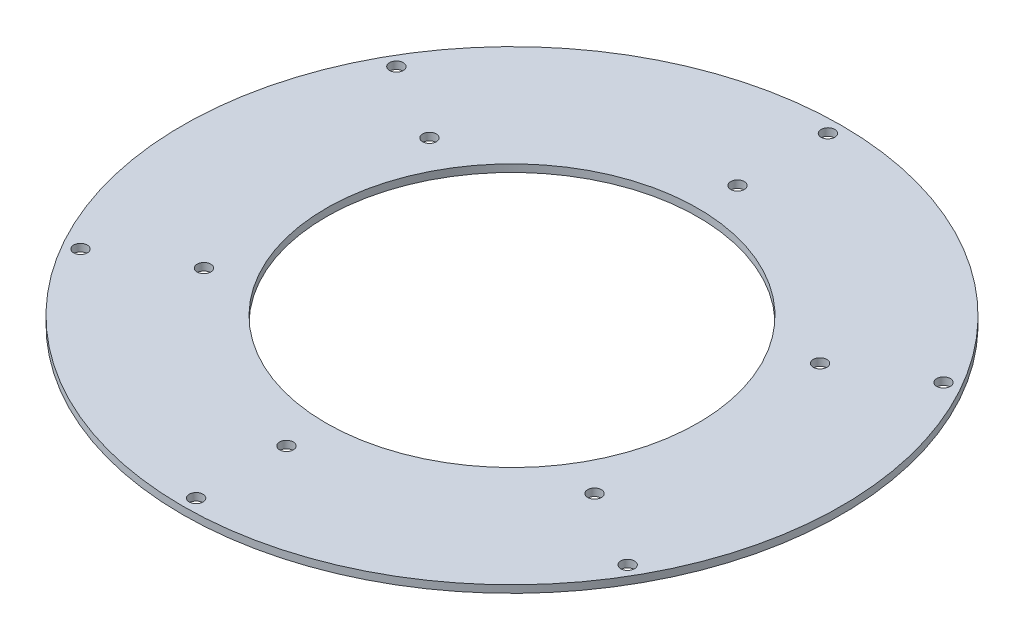
ISO-10303-21;
HEADER;
FILE_DESCRIPTION(('STEP AP214'),'2;1');
FILE_NAME('part.step','',(''),(''),'','','');
FILE_SCHEMA(('AUTOMOTIVE_DESIGN { 1 0 10303 214 1 1 1 1 }'));
ENDSEC;
DATA;
#1=APPLICATION_CONTEXT('core data for automotive mechanical design processes');
#2=APPLICATION_PROTOCOL_DEFINITION('international standard','automotive_design',2000,#1);
#3=PRODUCT_CONTEXT('',#1,'mechanical');
#4=PRODUCT('Part','Part','',(#3));
#5=PRODUCT_RELATED_PRODUCT_CATEGORY('part','',(#4));
#6=PRODUCT_DEFINITION_FORMATION('','',#4);
#7=PRODUCT_DEFINITION_CONTEXT('part definition',#1,'design');
#8=PRODUCT_DEFINITION('design','',#6,#7);
#9=PRODUCT_DEFINITION_SHAPE('','',#8);
#10=(LENGTH_UNIT() NAMED_UNIT(*) SI_UNIT(.MILLI.,.METRE.));
#11=(NAMED_UNIT(*) PLANE_ANGLE_UNIT() SI_UNIT($,.RADIAN.));
#12=(NAMED_UNIT(*) SI_UNIT($,.STERADIAN.) SOLID_ANGLE_UNIT());
#13=UNCERTAINTY_MEASURE_WITH_UNIT(LENGTH_MEASURE(1.E-05),#10,'distance_accuracy_value','');
#14=(GEOMETRIC_REPRESENTATION_CONTEXT(3) GLOBAL_UNCERTAINTY_ASSIGNED_CONTEXT((#13)) GLOBAL_UNIT_ASSIGNED_CONTEXT((#10,
#11,#12)) REPRESENTATION_CONTEXT('',''));
#15=CARTESIAN_POINT('',(0.,0.,0.));
#16=DIRECTION('',(0.,0.,1.));
#17=DIRECTION('',(1.,0.,0.));
#18=AXIS2_PLACEMENT_3D('',#15,#16,#17);
#19=CARTESIAN_POINT('',(0.,0.,0.));
#20=DIRECTION('',(0.,1.,0.));
#21=DIRECTION('',(0.,0.,1.));
#22=AXIS2_PLACEMENT_3D('',#19,#20,#21);
#23=PLANE('',#22);
#24=CARTESIAN_POINT('',(-42.0022320835452,0.,-24.25));
#25=DIRECTION('',(0.,1.,0.));
#26=DIRECTION('',(0.,0.,1.));
#27=AXIS2_PLACEMENT_3D('',#24,#25,#26);
#28=CIRCLE('',#27,1.4732);
#29=CARTESIAN_POINT('',(-42.0022320835452,0.,-22.7768));
#30=VERTEX_POINT('',#29);
#31=EDGE_CURVE('E77',#30,#30,#28,.T.);
#32=ORIENTED_EDGE('',*,*,#31,.T.);
#33=EDGE_LOOP('',(#32));
#34=FACE_BOUND('',#33,.T.);
#35=CARTESIAN_POINT('',(-42.0022320835452,0.,24.25));
#36=DIRECTION('',(0.,1.,0.));
#37=DIRECTION('',(0.,0.,1.));
#38=AXIS2_PLACEMENT_3D('',#35,#36,#37);
#39=CIRCLE('',#38,1.4732);
#40=CARTESIAN_POINT('',(-42.0022320835452,0.,25.7232));
#41=VERTEX_POINT('',#40);
#42=EDGE_CURVE('E80',#41,#41,#39,.T.);
#43=ORIENTED_EDGE('',*,*,#42,.T.);
#44=EDGE_LOOP('',(#43));
#45=FACE_BOUND('',#44,.T.);
#46=CARTESIAN_POINT('',(0.,0.,48.5));
#47=DIRECTION('',(0.,1.,0.));
#48=DIRECTION('',(0.,0.,1.));
#49=AXIS2_PLACEMENT_3D('',#46,#47,#48);
#50=CIRCLE('',#49,1.4732);
#51=CARTESIAN_POINT('',(0.,0.,49.9732));
#52=VERTEX_POINT('',#51);
#53=EDGE_CURVE('E83',#52,#52,#50,.T.);
#54=ORIENTED_EDGE('',*,*,#53,.T.);
#55=EDGE_LOOP('',(#54));
#56=FACE_BOUND('',#55,.T.);
#57=CARTESIAN_POINT('',(42.0022320835453,0.,24.25));
#58=DIRECTION('',(0.,1.,0.));
#59=DIRECTION('',(0.,0.,1.));
#60=AXIS2_PLACEMENT_3D('',#57,#58,#59);
#61=CIRCLE('',#60,1.4732);
#62=CARTESIAN_POINT('',(42.0022320835453,0.,25.7232));
#63=VERTEX_POINT('',#62);
#64=EDGE_CURVE('E86',#63,#63,#61,.T.);
#65=ORIENTED_EDGE('',*,*,#64,.T.);
#66=EDGE_LOOP('',(#65));
#67=FACE_BOUND('',#66,.T.);
#68=CARTESIAN_POINT('',(42.0022320835453,0.,-24.25));
#69=DIRECTION('',(0.,1.,0.));
#70=DIRECTION('',(0.,0.,1.));
#71=AXIS2_PLACEMENT_3D('',#68,#69,#70);
#72=CIRCLE('',#71,1.4732);
#73=CARTESIAN_POINT('',(42.0022320835453,0.,-22.7768));
#74=VERTEX_POINT('',#73);
#75=EDGE_CURVE('E89',#74,#74,#72,.T.);
#76=ORIENTED_EDGE('',*,*,#75,.T.);
#77=EDGE_LOOP('',(#76));
#78=FACE_BOUND('',#77,.T.);
#79=CARTESIAN_POINT('',(0.,0.,-48.5));
#80=DIRECTION('',(0.,1.,0.));
#81=DIRECTION('',(0.,0.,1.));
#82=AXIS2_PLACEMENT_3D('',#79,#80,#81);
#83=CIRCLE('',#82,1.4732);
#84=CARTESIAN_POINT('',(0.,0.,-47.0268));
#85=VERTEX_POINT('',#84);
#86=EDGE_CURVE('E91',#85,#85,#83,.T.);
#87=ORIENTED_EDGE('',*,*,#86,.T.);
#88=EDGE_LOOP('',(#87));
#89=FACE_BOUND('',#88,.T.);
#90=CARTESIAN_POINT('',(0.,0.,0.));
#91=DIRECTION('',(0.,1.,0.));
#92=DIRECTION('',(0.,0.,1.));
#93=AXIS2_PLACEMENT_3D('',#90,#91,#92);
#94=CIRCLE('',#93,40.);
#95=CARTESIAN_POINT('',(0.,0.,40.));
#96=VERTEX_POINT('',#95);
#97=EDGE_CURVE('E42',#96,#96,#94,.T.);
#98=ORIENTED_EDGE('',*,*,#97,.T.);
#99=EDGE_LOOP('',(#98));
#100=FACE_BOUND('',#99,.T.);
#101=CARTESIAN_POINT('',(0.,0.,0.));
#102=DIRECTION('',(0.,1.,0.));
#103=DIRECTION('',(0.,0.,1.));
#104=AXIS2_PLACEMENT_3D('',#101,#102,#103);
#105=CIRCLE('',#104,57.);
#106=CARTESIAN_POINT('',(0.,0.,57.));
#107=VERTEX_POINT('',#106);
#108=EDGE_CURVE('E253',#107,#107,#105,.T.);
#109=ORIENTED_EDGE('',*,*,#108,.F.);
#110=EDGE_LOOP('',(#109));
#111=FACE_BOUND('',#110,.T.);
#112=ADVANCED_FACE('F38',(#34,#45,#56,#67,#78,#89,#100,#111),#23,.F.);
#113=CARTESIAN_POINT('',(0.,1.6,-48.5));
#114=DIRECTION('',(0.,-1.,0.));
#115=DIRECTION('',(0.,0.,-1.));
#116=AXIS2_PLACEMENT_3D('',#113,#114,#115);
#117=CYLINDRICAL_SURFACE('',#116,1.4732);
#118=CARTESIAN_POINT('',(0.,1.6,-48.5));
#119=DIRECTION('',(0.,1.,0.));
#120=DIRECTION('',(0.,0.,1.));
#121=AXIS2_PLACEMENT_3D('',#118,#119,#120);
#122=CIRCLE('',#121,1.4732);
#123=CARTESIAN_POINT('',(0.,1.6,-47.0268));
#124=VERTEX_POINT('',#123);
#125=EDGE_CURVE('E46',#124,#124,#122,.T.);
#126=ORIENTED_EDGE('',*,*,#125,.T.);
#127=EDGE_LOOP('',(#126));
#128=FACE_BOUND('',#127,.T.);
#129=ORIENTED_EDGE('',*,*,#86,.F.);
#130=EDGE_LOOP('',(#129));
#131=FACE_BOUND('',#130,.T.);
#132=ADVANCED_FACE('F152',(#128,#131),#117,.F.);
#133=CARTESIAN_POINT('',(42.0022320835453,1.6,-24.25));
#134=DIRECTION('',(0.,-1.,0.));
#135=DIRECTION('',(0.,0.,-1.));
#136=AXIS2_PLACEMENT_3D('',#133,#134,#135);
#137=CYLINDRICAL_SURFACE('',#136,1.4732);
#138=CARTESIAN_POINT('',(42.0022320835453,1.6,-24.25));
#139=DIRECTION('',(0.,1.,0.));
#140=DIRECTION('',(0.,0.,1.));
#141=AXIS2_PLACEMENT_3D('',#138,#139,#140);
#142=CIRCLE('',#141,1.4732);
#143=CARTESIAN_POINT('',(42.0022320835453,1.6,-22.7768));
#144=VERTEX_POINT('',#143);
#145=EDGE_CURVE('E51',#144,#144,#142,.T.);
#146=ORIENTED_EDGE('',*,*,#145,.T.);
#147=EDGE_LOOP('',(#146));
#148=FACE_BOUND('',#147,.T.);
#149=ORIENTED_EDGE('',*,*,#75,.F.);
#150=EDGE_LOOP('',(#149));
#151=FACE_BOUND('',#150,.T.);
#152=ADVANCED_FACE('F139',(#148,#151),#137,.F.);
#153=CARTESIAN_POINT('',(42.0022320835453,1.6,24.25));
#154=DIRECTION('',(0.,-1.,0.));
#155=DIRECTION('',(0.,0.,-1.));
#156=AXIS2_PLACEMENT_3D('',#153,#154,#155);
#157=CYLINDRICAL_SURFACE('',#156,1.4732);
#158=CARTESIAN_POINT('',(42.0022320835453,1.6,24.25));
#159=DIRECTION('',(0.,1.,0.));
#160=DIRECTION('',(0.,0.,1.));
#161=AXIS2_PLACEMENT_3D('',#158,#159,#160);
#162=CIRCLE('',#161,1.4732);
#163=CARTESIAN_POINT('',(42.0022320835453,1.6,25.7232));
#164=VERTEX_POINT('',#163);
#165=EDGE_CURVE('E134',#164,#164,#162,.T.);
#166=ORIENTED_EDGE('',*,*,#165,.T.);
#167=EDGE_LOOP('',(#166));
#168=FACE_BOUND('',#167,.T.);
#169=ORIENTED_EDGE('',*,*,#64,.F.);
#170=EDGE_LOOP('',(#169));
#171=FACE_BOUND('',#170,.T.);
#172=ADVANCED_FACE('F160',(#168,#171),#157,.F.);
#173=CARTESIAN_POINT('',(0.,1.6,48.5));
#174=DIRECTION('',(0.,-1.,0.));
#175=DIRECTION('',(0.,0.,-1.));
#176=AXIS2_PLACEMENT_3D('',#173,#174,#175);
#177=CYLINDRICAL_SURFACE('',#176,1.4732);
#178=CARTESIAN_POINT('',(0.,1.6,48.5));
#179=DIRECTION('',(0.,1.,0.));
#180=DIRECTION('',(0.,0.,1.));
#181=AXIS2_PLACEMENT_3D('',#178,#179,#180);
#182=CIRCLE('',#181,1.4732);
#183=CARTESIAN_POINT('',(0.,1.6,49.9732));
#184=VERTEX_POINT('',#183);
#185=EDGE_CURVE('E131',#184,#184,#182,.T.);
#186=ORIENTED_EDGE('',*,*,#185,.T.);
#187=EDGE_LOOP('',(#186));
#188=FACE_BOUND('',#187,.T.);
#189=ORIENTED_EDGE('',*,*,#53,.F.);
#190=EDGE_LOOP('',(#189));
#191=FACE_BOUND('',#190,.T.);
#192=ADVANCED_FACE('F168',(#188,#191),#177,.F.);
#193=CARTESIAN_POINT('',(-42.0022320835452,1.6,24.25));
#194=DIRECTION('',(0.,-1.,0.));
#195=DIRECTION('',(0.,0.,-1.));
#196=AXIS2_PLACEMENT_3D('',#193,#194,#195);
#197=CYLINDRICAL_SURFACE('',#196,1.4732);
#198=CARTESIAN_POINT('',(-42.0022320835452,1.6,24.25));
#199=DIRECTION('',(0.,1.,0.));
#200=DIRECTION('',(0.,0.,1.));
#201=AXIS2_PLACEMENT_3D('',#198,#199,#200);
#202=CIRCLE('',#201,1.4732);
#203=CARTESIAN_POINT('',(-42.0022320835452,1.6,25.7232));
#204=VERTEX_POINT('',#203);
#205=EDGE_CURVE('E128',#204,#204,#202,.T.);
#206=ORIENTED_EDGE('',*,*,#205,.T.);
#207=EDGE_LOOP('',(#206));
#208=FACE_BOUND('',#207,.T.);
#209=ORIENTED_EDGE('',*,*,#42,.F.);
#210=EDGE_LOOP('',(#209));
#211=FACE_BOUND('',#210,.T.);
#212=ADVANCED_FACE('F172',(#208,#211),#197,.F.);
#213=CARTESIAN_POINT('',(-42.0022320835452,1.6,-24.25));
#214=DIRECTION('',(0.,-1.,0.));
#215=DIRECTION('',(0.,0.,-1.));
#216=AXIS2_PLACEMENT_3D('',#213,#214,#215);
#217=CYLINDRICAL_SURFACE('',#216,1.4732);
#218=CARTESIAN_POINT('',(-42.0022320835452,1.6,-24.25));
#219=DIRECTION('',(0.,1.,0.));
#220=DIRECTION('',(0.,0.,1.));
#221=AXIS2_PLACEMENT_3D('',#218,#219,#220);
#222=CIRCLE('',#221,1.4732);
#223=CARTESIAN_POINT('',(-42.0022320835452,1.6,-22.7768));
#224=VERTEX_POINT('',#223);
#225=EDGE_CURVE('E125',#224,#224,#222,.T.);
#226=ORIENTED_EDGE('',*,*,#225,.T.);
#227=EDGE_LOOP('',(#226));
#228=FACE_BOUND('',#227,.T.);
#229=ORIENTED_EDGE('',*,*,#31,.F.);
#230=EDGE_LOOP('',(#229));
#231=FACE_BOUND('',#230,.T.);
#232=ADVANCED_FACE('F176',(#228,#231),#217,.F.);
#233=CARTESIAN_POINT('',(0.,1.6,0.));
#234=DIRECTION('',(0.,-1.,0.));
#235=DIRECTION('',(0.,0.,-1.));
#236=AXIS2_PLACEMENT_3D('',#233,#234,#235);
#237=CYLINDRICAL_SURFACE('',#236,70.8759);
#238=CARTESIAN_POINT('',(0.,1.6,0.));
#239=DIRECTION('',(0.,1.,0.));
#240=DIRECTION('',(0.,0.,1.));
#241=AXIS2_PLACEMENT_3D('',#238,#239,#240);
#242=CIRCLE('',#241,70.8759);
#243=CARTESIAN_POINT('',(0.,1.6,70.8759));
#244=VERTEX_POINT('',#243);
#245=EDGE_CURVE('E122',#244,#244,#242,.T.);
#246=ORIENTED_EDGE('',*,*,#245,.F.);
#247=EDGE_LOOP('',(#246));
#248=FACE_BOUND('',#247,.T.);
#249=CARTESIAN_POINT('',(0.,0.,0.));
#250=DIRECTION('',(0.,1.,0.));
#251=DIRECTION('',(0.,0.,1.));
#252=AXIS2_PLACEMENT_3D('',#249,#250,#251);
#253=CIRCLE('',#252,70.8759);
#254=CARTESIAN_POINT('',(0.,0.,70.8759));
#255=VERTEX_POINT('',#254);
#256=EDGE_CURVE('E74',#255,#255,#253,.T.);
#257=ORIENTED_EDGE('',*,*,#256,.T.);
#258=EDGE_LOOP('',(#257));
#259=FACE_BOUND('',#258,.T.);
#260=ADVANCED_FACE('F180',(#248,#259),#237,.T.);
#261=CARTESIAN_POINT('',(-58.835990581037,1.6,-33.968975));
#262=DIRECTION('',(0.,-1.,0.));
#263=DIRECTION('',(0.,0.,-1.));
#264=AXIS2_PLACEMENT_3D('',#261,#262,#263);
#265=CYLINDRICAL_SURFACE('',#264,1.4732);
#266=CARTESIAN_POINT('',(-58.835990581037,1.6,-33.968975));
#267=DIRECTION('',(0.,1.,0.));
#268=DIRECTION('',(0.,0.,1.));
#269=AXIS2_PLACEMENT_3D('',#266,#267,#268);
#270=CIRCLE('',#269,1.4732);
#271=CARTESIAN_POINT('',(-58.835990581037,1.6,-32.495775));
#272=VERTEX_POINT('',#271);
#273=EDGE_CURVE('E119',#272,#272,#270,.T.);
#274=ORIENTED_EDGE('',*,*,#273,.T.);
#275=EDGE_LOOP('',(#274));
#276=FACE_BOUND('',#275,.T.);
#277=CARTESIAN_POINT('',(-58.835990581037,0.,-33.968975));
#278=DIRECTION('',(0.,1.,0.));
#279=DIRECTION('',(0.,0.,1.));
#280=AXIS2_PLACEMENT_3D('',#277,#278,#279);
#281=CIRCLE('',#280,1.4732);
#282=CARTESIAN_POINT('',(-58.835990581037,0.,-32.495775));
#283=VERTEX_POINT('',#282);
#284=EDGE_CURVE('E71',#283,#283,#281,.T.);
#285=ORIENTED_EDGE('',*,*,#284,.F.);
#286=EDGE_LOOP('',(#285));
#287=FACE_BOUND('',#286,.T.);
#288=ADVANCED_FACE('F184',(#276,#287),#265,.F.);
#289=CARTESIAN_POINT('',(-58.835990581037,1.6,33.968975));
#290=DIRECTION('',(0.,-1.,0.));
#291=DIRECTION('',(0.,0.,-1.));
#292=AXIS2_PLACEMENT_3D('',#289,#290,#291);
#293=CYLINDRICAL_SURFACE('',#292,1.4732);
#294=CARTESIAN_POINT('',(-58.835990581037,1.6,33.968975));
#295=DIRECTION('',(0.,1.,0.));
#296=DIRECTION('',(0.,0.,1.));
#297=AXIS2_PLACEMENT_3D('',#294,#295,#296);
#298=CIRCLE('',#297,1.4732);
#299=CARTESIAN_POINT('',(-58.835990581037,1.6,35.442175));
#300=VERTEX_POINT('',#299);
#301=EDGE_CURVE('E116',#300,#300,#298,.T.);
#302=ORIENTED_EDGE('',*,*,#301,.T.);
#303=EDGE_LOOP('',(#302));
#304=FACE_BOUND('',#303,.T.);
#305=CARTESIAN_POINT('',(-58.835990581037,0.,33.968975));
#306=DIRECTION('',(0.,1.,0.));
#307=DIRECTION('',(0.,0.,1.));
#308=AXIS2_PLACEMENT_3D('',#305,#306,#307);
#309=CIRCLE('',#308,1.4732);
#310=CARTESIAN_POINT('',(-58.835990581037,0.,35.442175));
#311=VERTEX_POINT('',#310);
#312=EDGE_CURVE('E68',#311,#311,#309,.T.);
#313=ORIENTED_EDGE('',*,*,#312,.F.);
#314=EDGE_LOOP('',(#313));
#315=FACE_BOUND('',#314,.T.);
#316=ADVANCED_FACE('F188',(#304,#315),#293,.F.);
#317=CARTESIAN_POINT('',(0.,1.6,67.93795));
#318=DIRECTION('',(0.,-1.,0.));
#319=DIRECTION('',(0.,0.,-1.));
#320=AXIS2_PLACEMENT_3D('',#317,#318,#319);
#321=CYLINDRICAL_SURFACE('',#320,1.4732);
#322=CARTESIAN_POINT('',(0.,1.6,67.93795));
#323=DIRECTION('',(0.,1.,0.));
#324=DIRECTION('',(0.,0.,1.));
#325=AXIS2_PLACEMENT_3D('',#322,#323,#324);
#326=CIRCLE('',#325,1.4732);
#327=CARTESIAN_POINT('',(0.,1.6,69.41115));
#328=VERTEX_POINT('',#327);
#329=EDGE_CURVE('E113',#328,#328,#326,.T.);
#330=ORIENTED_EDGE('',*,*,#329,.T.);
#331=EDGE_LOOP('',(#330));
#332=FACE_BOUND('',#331,.T.);
#333=CARTESIAN_POINT('',(0.,0.,67.93795));
#334=DIRECTION('',(0.,1.,0.));
#335=DIRECTION('',(0.,0.,1.));
#336=AXIS2_PLACEMENT_3D('',#333,#334,#335);
#337=CIRCLE('',#336,1.4732);
#338=CARTESIAN_POINT('',(0.,0.,69.41115));
#339=VERTEX_POINT('',#338);
#340=EDGE_CURVE('E65',#339,#339,#337,.T.);
#341=ORIENTED_EDGE('',*,*,#340,.F.);
#342=EDGE_LOOP('',(#341));
#343=FACE_BOUND('',#342,.T.);
#344=ADVANCED_FACE('F192',(#332,#343),#321,.F.);
#345=CARTESIAN_POINT('',(58.835990581037,1.6,33.968975));
#346=DIRECTION('',(0.,-1.,0.));
#347=DIRECTION('',(0.,0.,-1.));
#348=AXIS2_PLACEMENT_3D('',#345,#346,#347);
#349=CYLINDRICAL_SURFACE('',#348,1.47320000000002);
#350=CARTESIAN_POINT('',(58.835990581037,1.6,33.968975));
#351=DIRECTION('',(0.,1.,0.));
#352=DIRECTION('',(0.,0.,1.));
#353=AXIS2_PLACEMENT_3D('',#350,#351,#352);
#354=CIRCLE('',#353,1.47320000000002);
#355=CARTESIAN_POINT('',(58.835990581037,1.6,35.442175));
#356=VERTEX_POINT('',#355);
#357=EDGE_CURVE('E105',#356,#356,#354,.T.);
#358=ORIENTED_EDGE('',*,*,#357,.T.);
#359=EDGE_LOOP('',(#358));
#360=FACE_BOUND('',#359,.T.);
#361=CARTESIAN_POINT('',(58.835990581037,0.,33.968975));
#362=DIRECTION('',(0.,1.,0.));
#363=DIRECTION('',(0.,0.,1.));
#364=AXIS2_PLACEMENT_3D('',#361,#362,#363);
#365=CIRCLE('',#364,1.47320000000002);
#366=CARTESIAN_POINT('',(58.835990581037,0.,35.442175));
#367=VERTEX_POINT('',#366);
#368=EDGE_CURVE('E62',#367,#367,#365,.T.);
#369=ORIENTED_EDGE('',*,*,#368,.F.);
#370=EDGE_LOOP('',(#369));
#371=FACE_BOUND('',#370,.T.);
#372=ADVANCED_FACE('F196',(#360,#371),#349,.F.);
#373=CARTESIAN_POINT('',(58.835990581037,1.6,-33.968975));
#374=DIRECTION('',(0.,-1.,0.));
#375=DIRECTION('',(0.,0.,-1.));
#376=AXIS2_PLACEMENT_3D('',#373,#374,#375);
#377=CYLINDRICAL_SURFACE('',#376,1.4732);
#378=CARTESIAN_POINT('',(58.835990581037,1.6,-33.968975));
#379=DIRECTION('',(0.,1.,0.));
#380=DIRECTION('',(0.,0.,1.));
#381=AXIS2_PLACEMENT_3D('',#378,#379,#380);
#382=CIRCLE('',#381,1.4732);
#383=CARTESIAN_POINT('',(58.835990581037,1.6,-32.495775));
#384=VERTEX_POINT('',#383);
#385=EDGE_CURVE('E100',#384,#384,#382,.T.);
#386=ORIENTED_EDGE('',*,*,#385,.T.);
#387=EDGE_LOOP('',(#386));
#388=FACE_BOUND('',#387,.T.);
#389=CARTESIAN_POINT('',(58.835990581037,0.,-33.968975));
#390=DIRECTION('',(0.,1.,0.));
#391=DIRECTION('',(0.,0.,1.));
#392=AXIS2_PLACEMENT_3D('',#389,#390,#391);
#393=CIRCLE('',#392,1.4732);
#394=CARTESIAN_POINT('',(58.835990581037,0.,-32.495775));
#395=VERTEX_POINT('',#394);
#396=EDGE_CURVE('E58',#395,#395,#393,.T.);
#397=ORIENTED_EDGE('',*,*,#396,.F.);
#398=EDGE_LOOP('',(#397));
#399=FACE_BOUND('',#398,.T.);
#400=ADVANCED_FACE('F199',(#388,#399),#377,.F.);
#401=CARTESIAN_POINT('',(0.,1.6,-67.93795));
#402=DIRECTION('',(0.,-1.,0.));
#403=DIRECTION('',(0.,0.,-1.));
#404=AXIS2_PLACEMENT_3D('',#401,#402,#403);
#405=CYLINDRICAL_SURFACE('',#404,1.4732);
#406=CARTESIAN_POINT('',(0.,1.6,-67.93795));
#407=DIRECTION('',(0.,1.,0.));
#408=DIRECTION('',(0.,0.,1.));
#409=AXIS2_PLACEMENT_3D('',#406,#407,#408);
#410=CIRCLE('',#409,1.4732);
#411=CARTESIAN_POINT('',(0.,1.6,-66.46475));
#412=VERTEX_POINT('',#411);
#413=EDGE_CURVE('E96',#412,#412,#410,.T.);
#414=ORIENTED_EDGE('',*,*,#413,.T.);
#415=EDGE_LOOP('',(#414));
#416=FACE_BOUND('',#415,.T.);
#417=CARTESIAN_POINT('',(0.,0.,-67.93795));
#418=DIRECTION('',(0.,1.,0.));
#419=DIRECTION('',(0.,0.,1.));
#420=AXIS2_PLACEMENT_3D('',#417,#418,#419);
#421=CIRCLE('',#420,1.4732);
#422=CARTESIAN_POINT('',(0.,0.,-66.46475));
#423=VERTEX_POINT('',#422);
#424=EDGE_CURVE('E55',#423,#423,#421,.T.);
#425=ORIENTED_EDGE('',*,*,#424,.F.);
#426=EDGE_LOOP('',(#425));
#427=FACE_BOUND('',#426,.T.);
#428=ADVANCED_FACE('F40',(#416,#427),#405,.F.);
#429=CARTESIAN_POINT('',(0.,1.6,0.));
#430=DIRECTION('',(0.,-1.,0.));
#431=DIRECTION('',(0.,0.,-1.));
#432=AXIS2_PLACEMENT_3D('',#429,#430,#431);
#433=CYLINDRICAL_SURFACE('',#432,40.);
#434=CARTESIAN_POINT('',(0.,1.6,0.));
#435=DIRECTION('',(0.,1.,0.));
#436=DIRECTION('',(0.,0.,1.));
#437=AXIS2_PLACEMENT_3D('',#434,#435,#436);
#438=CIRCLE('',#437,40.);
#439=CARTESIAN_POINT('',(0.,1.6,40.));
#440=VERTEX_POINT('',#439);
#441=EDGE_CURVE('E10',#440,#440,#438,.T.);
#442=ORIENTED_EDGE('',*,*,#441,.T.);
#443=EDGE_LOOP('',(#442));
#444=FACE_BOUND('',#443,.T.);
#445=ORIENTED_EDGE('',*,*,#97,.F.);
#446=EDGE_LOOP('',(#445));
#447=FACE_BOUND('',#446,.T.);
#448=ADVANCED_FACE('F146',(#444,#447),#433,.F.);
#449=CARTESIAN_POINT('',(0.,1.6,0.));
#450=DIRECTION('',(0.,1.,0.));
#451=DIRECTION('',(0.,0.,1.));
#452=AXIS2_PLACEMENT_3D('',#449,#450,#451);
#453=PLANE('',#452);
#454=ORIENTED_EDGE('',*,*,#413,.F.);
#455=EDGE_LOOP('',(#454));
#456=FACE_BOUND('',#455,.T.);
#457=ORIENTED_EDGE('',*,*,#385,.F.);
#458=EDGE_LOOP('',(#457));
#459=FACE_BOUND('',#458,.T.);
#460=ORIENTED_EDGE('',*,*,#357,.F.);
#461=EDGE_LOOP('',(#460));
#462=FACE_BOUND('',#461,.T.);
#463=ORIENTED_EDGE('',*,*,#329,.F.);
#464=EDGE_LOOP('',(#463));
#465=FACE_BOUND('',#464,.T.);
#466=ORIENTED_EDGE('',*,*,#301,.F.);
#467=EDGE_LOOP('',(#466));
#468=FACE_BOUND('',#467,.T.);
#469=ORIENTED_EDGE('',*,*,#273,.F.);
#470=EDGE_LOOP('',(#469));
#471=FACE_BOUND('',#470,.T.);
#472=ORIENTED_EDGE('',*,*,#245,.T.);
#473=EDGE_LOOP('',(#472));
#474=FACE_BOUND('',#473,.T.);
#475=ORIENTED_EDGE('',*,*,#225,.F.);
#476=EDGE_LOOP('',(#475));
#477=FACE_BOUND('',#476,.T.);
#478=ORIENTED_EDGE('',*,*,#205,.F.);
#479=EDGE_LOOP('',(#478));
#480=FACE_BOUND('',#479,.T.);
#481=ORIENTED_EDGE('',*,*,#185,.F.);
#482=EDGE_LOOP('',(#481));
#483=FACE_BOUND('',#482,.T.);
#484=ORIENTED_EDGE('',*,*,#165,.F.);
#485=EDGE_LOOP('',(#484));
#486=FACE_BOUND('',#485,.T.);
#487=ORIENTED_EDGE('',*,*,#145,.F.);
#488=EDGE_LOOP('',(#487));
#489=FACE_BOUND('',#488,.T.);
#490=ORIENTED_EDGE('',*,*,#125,.F.);
#491=EDGE_LOOP('',(#490));
#492=FACE_BOUND('',#491,.T.);
#493=ORIENTED_EDGE('',*,*,#441,.F.);
#494=EDGE_LOOP('',(#493));
#495=FACE_BOUND('',#494,.T.);
#496=ADVANCED_FACE('F142',(#456,#459,#462,#465,#468,#471,#474,#477,#480,#483,#486,#489,#492,
#495),#453,.T.);
#497=CARTESIAN_POINT('',(0.,0.,0.));
#498=DIRECTION('',(0.,1.,0.));
#499=DIRECTION('',(0.,0.,1.));
#500=AXIS2_PLACEMENT_3D('',#497,#498,#499);
#501=CIRCLE('',#500,65.);
#502=CARTESIAN_POINT('',(0.,0.,65.));
#503=VERTEX_POINT('',#502);
#504=EDGE_CURVE('E108',#503,#503,#501,.T.);
#505=ORIENTED_EDGE('',*,*,#504,.T.);
#506=EDGE_LOOP('',(#505));
#507=FACE_BOUND('',#506,.T.);
#508=ORIENTED_EDGE('',*,*,#424,.T.);
#509=EDGE_LOOP('',(#508));
#510=FACE_BOUND('',#509,.T.);
#511=ORIENTED_EDGE('',*,*,#396,.T.);
#512=EDGE_LOOP('',(#511));
#513=FACE_BOUND('',#512,.T.);
#514=ORIENTED_EDGE('',*,*,#368,.T.);
#515=EDGE_LOOP('',(#514));
#516=FACE_BOUND('',#515,.T.);
#517=ORIENTED_EDGE('',*,*,#340,.T.);
#518=EDGE_LOOP('',(#517));
#519=FACE_BOUND('',#518,.T.);
#520=ORIENTED_EDGE('',*,*,#312,.T.);
#521=EDGE_LOOP('',(#520));
#522=FACE_BOUND('',#521,.T.);
#523=ORIENTED_EDGE('',*,*,#284,.T.);
#524=EDGE_LOOP('',(#523));
#525=FACE_BOUND('',#524,.T.);
#526=ORIENTED_EDGE('',*,*,#256,.F.);
#527=EDGE_LOOP('',(#526));
#528=FACE_BOUND('',#527,.T.);
#529=ADVANCED_FACE('F145',(#507,#510,#513,#516,#519,#522,#525,#528),#23,.F.);
#530=CARTESIAN_POINT('',(0.,0.1,0.));
#531=DIRECTION('',(0.,-1.,0.));
#532=DIRECTION('',(0.,0.,-1.));
#533=AXIS2_PLACEMENT_3D('',#530,#531,#532);
#534=CYLINDRICAL_SURFACE('',#533,57.);
#535=CARTESIAN_POINT('',(0.,0.1,0.));
#536=DIRECTION('',(0.,1.,0.));
#537=DIRECTION('',(0.,0.,1.));
#538=AXIS2_PLACEMENT_3D('',#535,#536,#537);
#539=CIRCLE('',#538,57.);
#540=CARTESIAN_POINT('',(0.,0.1,57.));
#541=VERTEX_POINT('',#540);
#542=EDGE_CURVE('E248',#541,#541,#539,.T.);
#543=ORIENTED_EDGE('',*,*,#542,.F.);
#544=EDGE_LOOP('',(#543));
#545=FACE_BOUND('',#544,.T.);
#546=ORIENTED_EDGE('',*,*,#108,.T.);
#547=EDGE_LOOP('',(#546));
#548=FACE_BOUND('',#547,.T.);
#549=ADVANCED_FACE('F212',(#545,#548),#534,.T.);
#550=CARTESIAN_POINT('',(0.,0.1,0.));
#551=DIRECTION('',(0.,-1.,0.));
#552=DIRECTION('',(0.,0.,-1.));
#553=AXIS2_PLACEMENT_3D('',#550,#551,#552);
#554=CYLINDRICAL_SURFACE('',#553,65.);
#555=CARTESIAN_POINT('',(0.,0.1,0.));
#556=DIRECTION('',(0.,1.,0.));
#557=DIRECTION('',(0.,0.,1.));
#558=AXIS2_PLACEMENT_3D('',#555,#556,#557);
#559=CIRCLE('',#558,65.);
#560=CARTESIAN_POINT('',(0.,0.1,65.));
#561=VERTEX_POINT('',#560);
#562=EDGE_CURVE('E59',#561,#561,#559,.T.);
#563=ORIENTED_EDGE('',*,*,#562,.T.);
#564=EDGE_LOOP('',(#563));
#565=FACE_BOUND('',#564,.T.);
#566=ORIENTED_EDGE('',*,*,#504,.F.);
#567=EDGE_LOOP('',(#566));
#568=FACE_BOUND('',#567,.T.);
#569=ADVANCED_FACE('F231',(#565,#568),#554,.F.);
#570=CARTESIAN_POINT('',(0.,0.1,0.));
#571=DIRECTION('',(0.,1.,0.));
#572=DIRECTION('',(0.,0.,1.));
#573=AXIS2_PLACEMENT_3D('',#570,#571,#572);
#574=PLANE('',#573);
#575=ORIENTED_EDGE('',*,*,#542,.T.);
#576=EDGE_LOOP('',(#575));
#577=FACE_BOUND('',#576,.T.);
#578=ORIENTED_EDGE('',*,*,#562,.F.);
#579=EDGE_LOOP('',(#578));
#580=FACE_BOUND('',#579,.T.);
#581=ADVANCED_FACE('F239',(#577,#580),#574,.F.);
#582=CLOSED_SHELL('',(#112,#132,#152,#172,#192,#212,#232,#260,#288,#316,#344,#372,#400,#428,
#448,#496,#529,#549,#569,#581));
#583=MANIFOLD_SOLID_BREP('B2',#582);
#584=ADVANCED_BREP_SHAPE_REPRESENTATION('',(#18,#583),#14);
#585=SHAPE_DEFINITION_REPRESENTATION(#9,#584);
ENDSEC;
END-ISO-10303-21;
